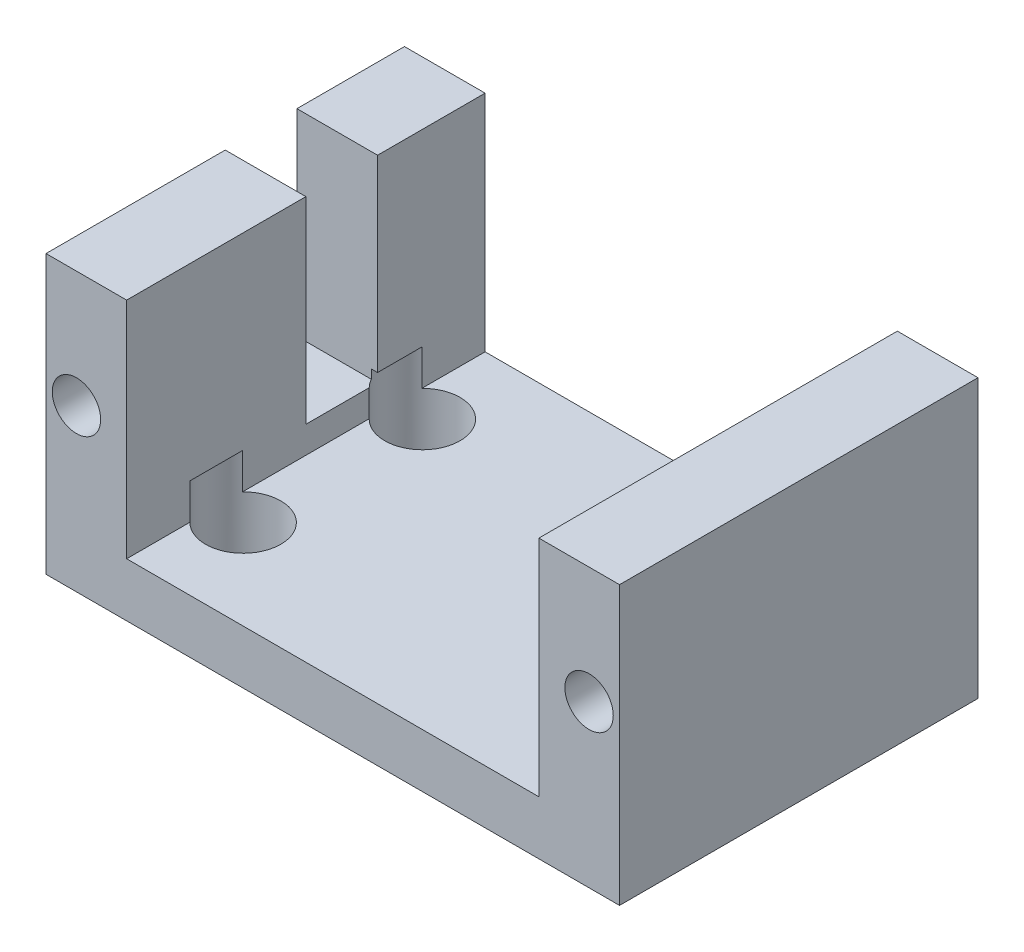
ISO-10303-21;
HEADER;
FILE_DESCRIPTION(('STEP AP214'),'2;1');
FILE_NAME('part.step','',(''),(''),'','','');
FILE_SCHEMA(('AUTOMOTIVE_DESIGN { 1 0 10303 214 1 1 1 1 }'));
ENDSEC;
DATA;
#1=APPLICATION_CONTEXT('core data for automotive mechanical design processes');
#2=APPLICATION_PROTOCOL_DEFINITION('international standard','automotive_design',2000,#1);
#3=PRODUCT_CONTEXT('',#1,'mechanical');
#4=PRODUCT('Part','Part','',(#3));
#5=PRODUCT_RELATED_PRODUCT_CATEGORY('part','',(#4));
#6=PRODUCT_DEFINITION_FORMATION('','',#4);
#7=PRODUCT_DEFINITION_CONTEXT('part definition',#1,'design');
#8=PRODUCT_DEFINITION('design','',#6,#7);
#9=PRODUCT_DEFINITION_SHAPE('','',#8);
#10=(LENGTH_UNIT() NAMED_UNIT(*) SI_UNIT(.MILLI.,.METRE.));
#11=(NAMED_UNIT(*) PLANE_ANGLE_UNIT() SI_UNIT($,.RADIAN.));
#12=(NAMED_UNIT(*) SI_UNIT($,.STERADIAN.) SOLID_ANGLE_UNIT());
#13=UNCERTAINTY_MEASURE_WITH_UNIT(LENGTH_MEASURE(1.E-05),#10,'distance_accuracy_value','');
#14=(GEOMETRIC_REPRESENTATION_CONTEXT(3) GLOBAL_UNCERTAINTY_ASSIGNED_CONTEXT((#13)) GLOBAL_UNIT_ASSIGNED_CONTEXT((#10,
#11,#12)) REPRESENTATION_CONTEXT('',''));
#15=CARTESIAN_POINT('',(0.,0.,0.));
#16=DIRECTION('',(0.,0.,1.));
#17=DIRECTION('',(1.,0.,0.));
#18=AXIS2_PLACEMENT_3D('',#15,#16,#17);
#19=CARTESIAN_POINT('',(-11.5,7.75,20.));
#20=DIRECTION('',(-1.,0.,0.));
#21=DIRECTION('',(0.,-1.,0.));
#22=AXIS2_PLACEMENT_3D('',#19,#20,#21);
#23=PLANE('',#22);
#24=DIRECTION('',(0.,0.,1.));
#25=VECTOR('',#24,1.);
#26=CARTESIAN_POINT('',(-11.5,-2.75,20.));
#27=LINE('',#26,#25);
#28=CARTESIAN_POINT('',(-11.5,-2.75,13.5303061543301));
#29=VERTEX_POINT('',#28);
#30=CARTESIAN_POINT('',(-11.5,-2.75,16.4696938456699));
#31=VERTEX_POINT('',#30);
#32=EDGE_CURVE('E213',#29,#31,#27,.T.);
#33=ORIENTED_EDGE('',*,*,#32,.F.);
#34=DIRECTION('',(0.,-1.,0.));
#35=VECTOR('',#34,1.);
#36=CARTESIAN_POINT('',(-11.5,-2.75,13.5303061543301));
#37=LINE('',#36,#35);
#38=CARTESIAN_POINT('',(-11.5,-4.75,13.5303061543301));
#39=VERTEX_POINT('',#38);
#40=EDGE_CURVE('E240',#29,#39,#37,.T.);
#41=ORIENTED_EDGE('',*,*,#40,.T.);
#42=DIRECTION('',(0.,0.,-1.));
#43=VECTOR('',#42,1.);
#44=CARTESIAN_POINT('',(-11.5,-4.75,20.));
#45=LINE('',#44,#43);
#46=CARTESIAN_POINT('',(-11.5,-4.75,6.46969384566991));
#47=VERTEX_POINT('',#46);
#48=EDGE_CURVE('E310',#39,#47,#45,.T.);
#49=ORIENTED_EDGE('',*,*,#48,.T.);
#50=DIRECTION('',(0.,-1.,0.));
#51=VECTOR('',#50,1.);
#52=CARTESIAN_POINT('',(-11.5,-2.75,6.46969384566991));
#53=LINE('',#52,#51);
#54=CARTESIAN_POINT('',(-11.5,-3.25,6.46969384566991));
#55=VERTEX_POINT('',#54);
#56=EDGE_CURVE('E402',#47,#55,#53,.F.);
#57=ORIENTED_EDGE('',*,*,#56,.T.);
#58=DIRECTION('',(0.,0.,-1.));
#59=VECTOR('',#58,1.);
#60=CARTESIAN_POINT('',(-11.5,-3.25,6.));
#61=LINE('',#60,#59);
#62=CARTESIAN_POINT('',(-11.5,-3.25,10.));
#63=VERTEX_POINT('',#62);
#64=EDGE_CURVE('E250',#63,#55,#61,.T.);
#65=ORIENTED_EDGE('',*,*,#64,.F.);
#66=DIRECTION('',(0.,-1.,0.));
#67=VECTOR('',#66,1.);
#68=CARTESIAN_POINT('',(-11.5,7.74999999999999,10.));
#69=LINE('',#68,#67);
#70=CARTESIAN_POINT('',(-11.5,7.75,10.));
#71=VERTEX_POINT('',#70);
#72=EDGE_CURVE('E270',#71,#63,#69,.T.);
#73=ORIENTED_EDGE('',*,*,#72,.F.);
#74=DIRECTION('',(0.,0.,-1.));
#75=VECTOR('',#74,1.);
#76=CARTESIAN_POINT('',(-11.5,7.75,20.));
#77=LINE('',#76,#75);
#78=CARTESIAN_POINT('',(-11.5,7.75,20.));
#79=VERTEX_POINT('',#78);
#80=EDGE_CURVE('E303',#79,#71,#77,.T.);
#81=ORIENTED_EDGE('',*,*,#80,.F.);
#82=DIRECTION('',(0.,1.,0.));
#83=VECTOR('',#82,1.);
#84=CARTESIAN_POINT('',(-11.5,7.75,20.));
#85=LINE('',#84,#83);
#86=CARTESIAN_POINT('',(-11.5,-4.75,20.));
#87=VERTEX_POINT('',#86);
#88=EDGE_CURVE('E289',#87,#79,#85,.T.);
#89=ORIENTED_EDGE('',*,*,#88,.F.);
#90=CARTESIAN_POINT('',(-11.5,-4.75,16.4696938456699));
#91=VERTEX_POINT('',#90);
#92=EDGE_CURVE('E307',#87,#91,#45,.T.);
#93=ORIENTED_EDGE('',*,*,#92,.T.);
#94=DIRECTION('',(0.,-1.,0.));
#95=VECTOR('',#94,1.);
#96=CARTESIAN_POINT('',(-11.5,-2.75,16.4696938456699));
#97=LINE('',#96,#95);
#98=EDGE_CURVE('E232',#91,#31,#97,.F.);
#99=ORIENTED_EDGE('',*,*,#98,.T.);
#100=EDGE_LOOP('',(#33,#41,#49,#57,#65,#73,#81,#89,#93,#99));
#101=FACE_BOUND('',#100,.T.);
#102=ADVANCED_FACE('F35',(#101),#23,.F.);
#103=CARTESIAN_POINT('',(-16.,7.75,20.));
#104=DIRECTION('',(0.,-1.,0.));
#105=DIRECTION('',(0.,0.,-1.));
#106=AXIS2_PLACEMENT_3D('',#103,#104,#105);
#107=PLANE('',#106);
#108=ORIENTED_EDGE('',*,*,#80,.T.);
#109=DIRECTION('',(-1.,0.,0.));
#110=VECTOR('',#109,1.);
#111=CARTESIAN_POINT('',(16.001,7.75,10.));
#112=LINE('',#111,#110);
#113=CARTESIAN_POINT('',(-16.,7.75,10.));
#114=VERTEX_POINT('',#113);
#115=EDGE_CURVE('E276',#71,#114,#112,.T.);
#116=ORIENTED_EDGE('',*,*,#115,.T.);
#117=DIRECTION('',(0.,0.,-1.));
#118=VECTOR('',#117,1.);
#119=CARTESIAN_POINT('',(-16.,7.75,20.));
#120=LINE('',#119,#118);
#121=CARTESIAN_POINT('',(-16.,7.75,20.));
#122=VERTEX_POINT('',#121);
#123=EDGE_CURVE('E343',#122,#114,#120,.T.);
#124=ORIENTED_EDGE('',*,*,#123,.F.);
#125=DIRECTION('',(-1.,0.,0.));
#126=VECTOR('',#125,1.);
#127=CARTESIAN_POINT('',(-16.,7.75,20.));
#128=LINE('',#127,#126);
#129=EDGE_CURVE('E318',#79,#122,#128,.T.);
#130=ORIENTED_EDGE('',*,*,#129,.F.);
#131=EDGE_LOOP('',(#108,#116,#124,#130));
#132=FACE_BOUND('',#131,.T.);
#133=ADVANCED_FACE('F391',(#132),#107,.F.);
#134=DIRECTION('',(-1.,0.,0.));
#135=VECTOR('',#134,1.);
#136=CARTESIAN_POINT('',(-16.,7.75,0.));
#137=LINE('',#136,#135);
#138=CARTESIAN_POINT('',(16.,7.75,0.));
#139=VERTEX_POINT('',#138);
#140=CARTESIAN_POINT('',(11.5,7.75,0.));
#141=VERTEX_POINT('',#140);
#142=EDGE_CURVE('E331',#139,#141,#137,.T.);
#143=ORIENTED_EDGE('',*,*,#142,.T.);
#144=DIRECTION('',(0.,0.,-1.));
#145=VECTOR('',#144,1.);
#146=CARTESIAN_POINT('',(11.5,7.75,20.));
#147=LINE('',#146,#145);
#148=CARTESIAN_POINT('',(11.5,7.75,20.));
#149=VERTEX_POINT('',#148);
#150=EDGE_CURVE('E300',#149,#141,#147,.T.);
#151=ORIENTED_EDGE('',*,*,#150,.F.);
#152=CARTESIAN_POINT('',(16.,7.75,20.));
#153=VERTEX_POINT('',#152);
#154=EDGE_CURVE('E320',#153,#149,#128,.T.);
#155=ORIENTED_EDGE('',*,*,#154,.F.);
#156=DIRECTION('',(0.,0.,-1.));
#157=VECTOR('',#156,1.);
#158=CARTESIAN_POINT('',(16.,7.75,20.));
#159=LINE('',#158,#157);
#160=EDGE_CURVE('E189',#153,#139,#159,.T.);
#161=ORIENTED_EDGE('',*,*,#160,.T.);
#162=EDGE_LOOP('',(#143,#151,#155,#161));
#163=FACE_BOUND('',#162,.T.);
#164=ADVANCED_FACE('F348',(#163),#107,.F.);
#165=CARTESIAN_POINT('',(16.,-7.75,20.));
#166=DIRECTION('',(-1.,0.,0.));
#167=DIRECTION('',(0.,0.,1.));
#168=AXIS2_PLACEMENT_3D('',#165,#166,#167);
#169=PLANE('',#168);
#170=DIRECTION('',(0.,1.,0.));
#171=VECTOR('',#170,1.);
#172=CARTESIAN_POINT('',(16.,-7.75,0.));
#173=LINE('',#172,#171);
#174=CARTESIAN_POINT('',(16.,-7.75,0.));
#175=VERTEX_POINT('',#174);
#176=EDGE_CURVE('E302',#175,#139,#173,.T.);
#177=ORIENTED_EDGE('',*,*,#176,.T.);
#178=ORIENTED_EDGE('',*,*,#160,.F.);
#179=DIRECTION('',(0.,1.,0.));
#180=VECTOR('',#179,1.);
#181=CARTESIAN_POINT('',(16.,-7.75,20.));
#182=LINE('',#181,#180);
#183=CARTESIAN_POINT('',(16.,-7.75,20.));
#184=VERTEX_POINT('',#183);
#185=EDGE_CURVE('E315',#184,#153,#182,.T.);
#186=ORIENTED_EDGE('',*,*,#185,.F.);
#187=DIRECTION('',(0.,0.,-1.));
#188=VECTOR('',#187,1.);
#189=CARTESIAN_POINT('',(16.,-7.75,20.));
#190=LINE('',#189,#188);
#191=EDGE_CURVE('E327',#184,#175,#190,.T.);
#192=ORIENTED_EDGE('',*,*,#191,.T.);
#193=EDGE_LOOP('',(#177,#178,#186,#192));
#194=FACE_BOUND('',#193,.T.);
#195=ADVANCED_FACE('F37',(#194),#169,.F.);
#196=CARTESIAN_POINT('',(-16.,7.75,6.));
#197=VERTEX_POINT('',#196);
#198=CARTESIAN_POINT('',(-16.,7.75,0.));
#199=VERTEX_POINT('',#198);
#200=EDGE_CURVE('E342',#197,#199,#120,.T.);
#201=ORIENTED_EDGE('',*,*,#200,.F.);
#202=DIRECTION('',(-1.,0.,0.));
#203=VECTOR('',#202,1.);
#204=CARTESIAN_POINT('',(16.001,7.75,6.));
#205=LINE('',#204,#203);
#206=CARTESIAN_POINT('',(-11.5,7.75,6.));
#207=VERTEX_POINT('',#206);
#208=EDGE_CURVE('E274',#207,#197,#205,.T.);
#209=ORIENTED_EDGE('',*,*,#208,.F.);
#210=CARTESIAN_POINT('',(-11.5,7.75,0.));
#211=VERTEX_POINT('',#210);
#212=EDGE_CURVE('E306',#207,#211,#77,.T.);
#213=ORIENTED_EDGE('',*,*,#212,.T.);
#214=EDGE_CURVE('E330',#211,#199,#137,.T.);
#215=ORIENTED_EDGE('',*,*,#214,.T.);
#216=EDGE_LOOP('',(#201,#209,#213,#215));
#217=FACE_BOUND('',#216,.T.);
#218=ADVANCED_FACE('F376',(#217),#107,.F.);
#219=CARTESIAN_POINT('',(-16.,-7.75,20.));
#220=DIRECTION('',(1.,0.,0.));
#221=DIRECTION('',(0.,0.,-1.));
#222=AXIS2_PLACEMENT_3D('',#219,#220,#221);
#223=PLANE('',#222);
#224=ORIENTED_EDGE('',*,*,#123,.T.);
#225=DIRECTION('',(0.,1.,0.));
#226=VECTOR('',#225,1.);
#227=CARTESIAN_POINT('',(-16.,7.75,10.));
#228=LINE('',#227,#226);
#229=CARTESIAN_POINT('',(-16.,-3.25,10.));
#230=VERTEX_POINT('',#229);
#231=EDGE_CURVE('E262',#230,#114,#228,.T.);
#232=ORIENTED_EDGE('',*,*,#231,.F.);
#233=DIRECTION('',(0.,0.,1.));
#234=VECTOR('',#233,1.);
#235=CARTESIAN_POINT('',(-16.,-3.25,6.));
#236=LINE('',#235,#234);
#237=CARTESIAN_POINT('',(-16.,-3.25,6.));
#238=VERTEX_POINT('',#237);
#239=EDGE_CURVE('E265',#238,#230,#236,.T.);
#240=ORIENTED_EDGE('',*,*,#239,.F.);
#241=DIRECTION('',(0.,-1.,0.));
#242=VECTOR('',#241,1.);
#243=CARTESIAN_POINT('',(-16.,7.75,6.));
#244=LINE('',#243,#242);
#245=EDGE_CURVE('E268',#197,#238,#244,.T.);
#246=ORIENTED_EDGE('',*,*,#245,.F.);
#247=ORIENTED_EDGE('',*,*,#200,.T.);
#248=DIRECTION('',(0.,-1.,0.));
#249=VECTOR('',#248,1.);
#250=CARTESIAN_POINT('',(-16.,-7.75,0.));
#251=LINE('',#250,#249);
#252=CARTESIAN_POINT('',(-16.,-7.75,0.));
#253=VERTEX_POINT('',#252);
#254=EDGE_CURVE('E334',#199,#253,#251,.T.);
#255=ORIENTED_EDGE('',*,*,#254,.T.);
#256=DIRECTION('',(0.,0.,-1.));
#257=VECTOR('',#256,1.);
#258=CARTESIAN_POINT('',(-16.,-7.75,20.));
#259=LINE('',#258,#257);
#260=CARTESIAN_POINT('',(-16.,-7.75,20.));
#261=VERTEX_POINT('',#260);
#262=EDGE_CURVE('E339',#261,#253,#259,.T.);
#263=ORIENTED_EDGE('',*,*,#262,.F.);
#264=DIRECTION('',(0.,-1.,0.));
#265=VECTOR('',#264,1.);
#266=CARTESIAN_POINT('',(-16.,-7.75,20.));
#267=LINE('',#266,#265);
#268=EDGE_CURVE('E323',#122,#261,#267,.T.);
#269=ORIENTED_EDGE('',*,*,#268,.F.);
#270=EDGE_LOOP('',(#224,#232,#240,#246,#247,#255,#263,#269));
#271=FACE_BOUND('',#270,.T.);
#272=ADVANCED_FACE('F370',(#271),#223,.F.);
#273=CARTESIAN_POINT('',(-16.,-7.75,20.));
#274=DIRECTION('',(0.,1.,0.));
#275=DIRECTION('',(0.,0.,1.));
#276=AXIS2_PLACEMENT_3D('',#273,#274,#275);
#277=PLANE('',#276);
#278=CARTESIAN_POINT('',(10.,-7.75,5.));
#279=DIRECTION('',(0.,-1.,0.));
#280=DIRECTION('',(0.,0.,-1.));
#281=AXIS2_PLACEMENT_3D('',#278,#279,#280);
#282=CIRCLE('',#281,2.1);
#283=CARTESIAN_POINT('',(10.,-7.75,2.9));
#284=VERTEX_POINT('',#283);
#285=EDGE_CURVE('E417',#284,#284,#282,.T.);
#286=ORIENTED_EDGE('',*,*,#285,.F.);
#287=EDGE_LOOP('',(#286));
#288=FACE_BOUND('',#287,.T.);
#289=CARTESIAN_POINT('',(-10.,-7.75,15.));
#290=DIRECTION('',(0.,-1.,0.));
#291=DIRECTION('',(0.,0.,-1.));
#292=AXIS2_PLACEMENT_3D('',#289,#290,#291);
#293=CIRCLE('',#292,2.1);
#294=CARTESIAN_POINT('',(-10.,-7.75,12.9));
#295=VERTEX_POINT('',#294);
#296=EDGE_CURVE('E196',#295,#295,#293,.T.);
#297=ORIENTED_EDGE('',*,*,#296,.F.);
#298=EDGE_LOOP('',(#297));
#299=FACE_BOUND('',#298,.T.);
#300=CARTESIAN_POINT('',(-10.,-7.75,5.));
#301=DIRECTION('',(0.,-1.,0.));
#302=DIRECTION('',(0.,0.,-1.));
#303=AXIS2_PLACEMENT_3D('',#300,#301,#302);
#304=CIRCLE('',#303,2.1);
#305=CARTESIAN_POINT('',(-10.,-7.75,2.9));
#306=VERTEX_POINT('',#305);
#307=EDGE_CURVE('E197',#306,#306,#304,.T.);
#308=ORIENTED_EDGE('',*,*,#307,.F.);
#309=EDGE_LOOP('',(#308));
#310=FACE_BOUND('',#309,.T.);
#311=CARTESIAN_POINT('',(10.,-7.75,15.));
#312=DIRECTION('',(0.,-1.,0.));
#313=DIRECTION('',(0.,0.,-1.));
#314=AXIS2_PLACEMENT_3D('',#311,#312,#313);
#315=CIRCLE('',#314,2.1);
#316=CARTESIAN_POINT('',(10.,-7.75,12.9));
#317=VERTEX_POINT('',#316);
#318=EDGE_CURVE('E223',#317,#317,#315,.T.);
#319=ORIENTED_EDGE('',*,*,#318,.F.);
#320=EDGE_LOOP('',(#319));
#321=FACE_BOUND('',#320,.T.);
#322=DIRECTION('',(1.,0.,0.));
#323=VECTOR('',#322,1.);
#324=CARTESIAN_POINT('',(-16.,-7.75,0.));
#325=LINE('',#324,#323);
#326=EDGE_CURVE('E319',#253,#175,#325,.T.);
#327=ORIENTED_EDGE('',*,*,#326,.T.);
#328=ORIENTED_EDGE('',*,*,#191,.F.);
#329=DIRECTION('',(1.,0.,0.));
#330=VECTOR('',#329,1.);
#331=CARTESIAN_POINT('',(-16.,-7.75,20.));
#332=LINE('',#331,#330);
#333=EDGE_CURVE('E325',#261,#184,#332,.T.);
#334=ORIENTED_EDGE('',*,*,#333,.F.);
#335=ORIENTED_EDGE('',*,*,#262,.T.);
#336=EDGE_LOOP('',(#327,#328,#334,#335));
#337=FACE_BOUND('',#336,.T.);
#338=ADVANCED_FACE('F368',(#288,#299,#310,#321,#337),#277,.F.);
#339=CARTESIAN_POINT('',(0.,0.,20.));
#340=DIRECTION('',(0.,0.,-1.));
#341=DIRECTION('',(-1.,0.,0.));
#342=AXIS2_PLACEMENT_3D('',#339,#340,#341);
#343=PLANE('',#342);
#344=CARTESIAN_POINT('',(-14.3,1.25,20.));
#345=DIRECTION('',(0.,0.,1.));
#346=DIRECTION('',(1.,0.,0.));
#347=AXIS2_PLACEMENT_3D('',#344,#345,#346);
#348=CIRCLE('',#347,1.35000000000001);
#349=CARTESIAN_POINT('',(-12.95,1.25,20.));
#350=VERTEX_POINT('',#349);
#351=EDGE_CURVE('E251',#350,#350,#348,.T.);
#352=ORIENTED_EDGE('',*,*,#351,.F.);
#353=EDGE_LOOP('',(#352));
#354=FACE_BOUND('',#353,.T.);
#355=CARTESIAN_POINT('',(14.3,1.25,20.));
#356=DIRECTION('',(0.,0.,1.));
#357=DIRECTION('',(1.,0.,0.));
#358=AXIS2_PLACEMENT_3D('',#355,#356,#357);
#359=CIRCLE('',#358,1.35);
#360=CARTESIAN_POINT('',(15.65,1.25,20.));
#361=VERTEX_POINT('',#360);
#362=EDGE_CURVE('E246',#361,#361,#359,.T.);
#363=ORIENTED_EDGE('',*,*,#362,.F.);
#364=EDGE_LOOP('',(#363));
#365=FACE_BOUND('',#364,.T.);
#366=ORIENTED_EDGE('',*,*,#154,.T.);
#367=DIRECTION('',(0.,-1.,0.));
#368=VECTOR('',#367,1.);
#369=CARTESIAN_POINT('',(11.5,7.75,20.));
#370=LINE('',#369,#368);
#371=CARTESIAN_POINT('',(11.5,-4.75,20.));
#372=VERTEX_POINT('',#371);
#373=EDGE_CURVE('E282',#149,#372,#370,.T.);
#374=ORIENTED_EDGE('',*,*,#373,.T.);
#375=DIRECTION('',(-1.,0.,0.));
#376=VECTOR('',#375,1.);
#377=CARTESIAN_POINT('',(11.5,-4.75,20.));
#378=LINE('',#377,#376);
#379=EDGE_CURVE('E285',#372,#87,#378,.T.);
#380=ORIENTED_EDGE('',*,*,#379,.T.);
#381=ORIENTED_EDGE('',*,*,#88,.T.);
#382=ORIENTED_EDGE('',*,*,#129,.T.);
#383=ORIENTED_EDGE('',*,*,#268,.T.);
#384=ORIENTED_EDGE('',*,*,#333,.T.);
#385=ORIENTED_EDGE('',*,*,#185,.T.);
#386=EDGE_LOOP('',(#366,#374,#380,#381,#382,#383,#384,#385));
#387=FACE_BOUND('',#386,.T.);
#388=ADVANCED_FACE('F363',(#354,#365,#387),#343,.F.);
#389=CARTESIAN_POINT('',(0.,0.,0.));
#390=DIRECTION('',(0.,0.,-1.));
#391=DIRECTION('',(-1.,0.,0.));
#392=AXIS2_PLACEMENT_3D('',#389,#390,#391);
#393=PLANE('',#392);
#394=DIRECTION('',(0.,-1.,0.));
#395=VECTOR('',#394,1.);
#396=CARTESIAN_POINT('',(11.5,7.75,0.));
#397=LINE('',#396,#395);
#398=CARTESIAN_POINT('',(11.5,-4.75,0.));
#399=VERTEX_POINT('',#398);
#400=EDGE_CURVE('E281',#141,#399,#397,.T.);
#401=ORIENTED_EDGE('',*,*,#400,.F.);
#402=ORIENTED_EDGE('',*,*,#142,.F.);
#403=ORIENTED_EDGE('',*,*,#176,.F.);
#404=ORIENTED_EDGE('',*,*,#326,.F.);
#405=ORIENTED_EDGE('',*,*,#254,.F.);
#406=ORIENTED_EDGE('',*,*,#214,.F.);
#407=DIRECTION('',(0.,1.,0.));
#408=VECTOR('',#407,1.);
#409=CARTESIAN_POINT('',(-11.5,7.75,0.));
#410=LINE('',#409,#408);
#411=CARTESIAN_POINT('',(-11.5,-4.75,0.));
#412=VERTEX_POINT('',#411);
#413=EDGE_CURVE('E286',#412,#211,#410,.T.);
#414=ORIENTED_EDGE('',*,*,#413,.F.);
#415=DIRECTION('',(-1.,0.,0.));
#416=VECTOR('',#415,1.);
#417=CARTESIAN_POINT('',(11.5,-4.75,0.));
#418=LINE('',#417,#416);
#419=EDGE_CURVE('E295',#399,#412,#418,.T.);
#420=ORIENTED_EDGE('',*,*,#419,.F.);
#421=EDGE_LOOP('',(#401,#402,#403,#404,#405,#406,#414,#420));
#422=FACE_BOUND('',#421,.T.);
#423=ADVANCED_FACE('F357',(#422),#393,.T.);
#424=CARTESIAN_POINT('',(11.5,7.75,20.));
#425=DIRECTION('',(1.,0.,0.));
#426=DIRECTION('',(0.,1.,0.));
#427=AXIS2_PLACEMENT_3D('',#424,#425,#426);
#428=PLANE('',#427);
#429=DIRECTION('',(0.,0.,-1.));
#430=VECTOR('',#429,1.);
#431=CARTESIAN_POINT('',(11.5,-2.75,20.));
#432=LINE('',#431,#430);
#433=CARTESIAN_POINT('',(11.5,-2.75,6.46969384566991));
#434=VERTEX_POINT('',#433);
#435=CARTESIAN_POINT('',(11.5,-2.75,3.5303061543301));
#436=VERTEX_POINT('',#435);
#437=EDGE_CURVE('E11',#434,#436,#432,.T.);
#438=ORIENTED_EDGE('',*,*,#437,.F.);
#439=DIRECTION('',(0.,-1.,0.));
#440=VECTOR('',#439,1.);
#441=CARTESIAN_POINT('',(11.5,-2.75,6.46969384566991));
#442=LINE('',#441,#440);
#443=CARTESIAN_POINT('',(11.5,-4.75,6.46969384566991));
#444=VERTEX_POINT('',#443);
#445=EDGE_CURVE('E244',#434,#444,#442,.T.);
#446=ORIENTED_EDGE('',*,*,#445,.T.);
#447=DIRECTION('',(0.,0.,-1.));
#448=VECTOR('',#447,1.);
#449=CARTESIAN_POINT('',(11.5,-4.75,20.));
#450=LINE('',#449,#448);
#451=CARTESIAN_POINT('',(11.5,-4.75,13.5303061543301));
#452=VERTEX_POINT('',#451);
#453=EDGE_CURVE('E230',#452,#444,#450,.T.);
#454=ORIENTED_EDGE('',*,*,#453,.F.);
#455=DIRECTION('',(0.,-1.,0.));
#456=VECTOR('',#455,1.);
#457=CARTESIAN_POINT('',(11.5,-2.75,13.5303061543301));
#458=LINE('',#457,#456);
#459=CARTESIAN_POINT('',(11.5,-2.75,13.5303061543301));
#460=VERTEX_POINT('',#459);
#461=EDGE_CURVE('E58',#452,#460,#458,.F.);
#462=ORIENTED_EDGE('',*,*,#461,.T.);
#463=DIRECTION('',(0.,0.,-1.));
#464=VECTOR('',#463,1.);
#465=CARTESIAN_POINT('',(11.5,-2.75,20.));
#466=LINE('',#465,#464);
#467=CARTESIAN_POINT('',(11.5,-2.75,16.4696938456699));
#468=VERTEX_POINT('',#467);
#469=EDGE_CURVE('E43',#468,#460,#466,.T.);
#470=ORIENTED_EDGE('',*,*,#469,.F.);
#471=DIRECTION('',(0.,-1.,0.));
#472=VECTOR('',#471,1.);
#473=CARTESIAN_POINT('',(11.5,-2.75,16.4696938456699));
#474=LINE('',#473,#472);
#475=CARTESIAN_POINT('',(11.5,-4.75,16.4696938456699));
#476=VERTEX_POINT('',#475);
#477=EDGE_CURVE('E222',#468,#476,#474,.T.);
#478=ORIENTED_EDGE('',*,*,#477,.T.);
#479=EDGE_CURVE('E312',#372,#476,#450,.T.);
#480=ORIENTED_EDGE('',*,*,#479,.F.);
#481=ORIENTED_EDGE('',*,*,#373,.F.);
#482=ORIENTED_EDGE('',*,*,#150,.T.);
#483=ORIENTED_EDGE('',*,*,#400,.T.);
#484=CARTESIAN_POINT('',(11.5,-4.75,3.5303061543301));
#485=VERTEX_POINT('',#484);
#486=EDGE_CURVE('E292',#485,#399,#450,.T.);
#487=ORIENTED_EDGE('',*,*,#486,.F.);
#488=DIRECTION('',(0.,-1.,0.));
#489=VECTOR('',#488,1.);
#490=CARTESIAN_POINT('',(11.5,-2.75,3.5303061543301));
#491=LINE('',#490,#489);
#492=EDGE_CURVE('E50',#485,#436,#491,.F.);
#493=ORIENTED_EDGE('',*,*,#492,.T.);
#494=EDGE_LOOP('',(#438,#446,#454,#462,#470,#478,#480,#481,#482,#483,#487,#493));
#495=FACE_BOUND('',#494,.T.);
#496=ADVANCED_FACE('F227',(#495),#428,.F.);
#497=DIRECTION('',(0.,0.,1.));
#498=VECTOR('',#497,1.);
#499=CARTESIAN_POINT('',(-11.5,-2.75,20.));
#500=LINE('',#499,#498);
#501=CARTESIAN_POINT('',(-11.5,-2.75,3.53030615433009));
#502=VERTEX_POINT('',#501);
#503=CARTESIAN_POINT('',(-11.5,-2.75,6.));
#504=VERTEX_POINT('',#503);
#505=EDGE_CURVE('E184',#502,#504,#500,.T.);
#506=ORIENTED_EDGE('',*,*,#505,.F.);
#507=DIRECTION('',(0.,-1.,0.));
#508=VECTOR('',#507,1.);
#509=CARTESIAN_POINT('',(-11.5,-2.75,3.53030615433009));
#510=LINE('',#509,#508);
#511=CARTESIAN_POINT('',(-11.5,-4.75,3.53030615433009));
#512=VERTEX_POINT('',#511);
#513=EDGE_CURVE('E195',#502,#512,#510,.T.);
#514=ORIENTED_EDGE('',*,*,#513,.T.);
#515=EDGE_CURVE('E311',#512,#412,#45,.T.);
#516=ORIENTED_EDGE('',*,*,#515,.T.);
#517=ORIENTED_EDGE('',*,*,#413,.T.);
#518=ORIENTED_EDGE('',*,*,#212,.F.);
#519=DIRECTION('',(0.,1.,0.));
#520=VECTOR('',#519,1.);
#521=CARTESIAN_POINT('',(-11.5,7.74999999999999,6.));
#522=LINE('',#521,#520);
#523=EDGE_CURVE('E261',#504,#207,#522,.T.);
#524=ORIENTED_EDGE('',*,*,#523,.F.);
#525=EDGE_LOOP('',(#506,#514,#516,#517,#518,#524));
#526=FACE_BOUND('',#525,.T.);
#527=ADVANCED_FACE('F380',(#526),#23,.F.);
#528=CARTESIAN_POINT('',(11.5,-4.75,20.));
#529=DIRECTION('',(0.,-1.,0.));
#530=DIRECTION('',(0.,0.,-1.));
#531=AXIS2_PLACEMENT_3D('',#528,#529,#530);
#532=PLANE('',#531);
#533=ORIENTED_EDGE('',*,*,#453,.T.);
#534=CARTESIAN_POINT('',(10.,-4.75,5.));
#535=DIRECTION('',(0.,-1.,0.));
#536=DIRECTION('',(0.,0.,-1.));
#537=AXIS2_PLACEMENT_3D('',#534,#535,#536);
#538=CIRCLE('',#537,2.1);
#539=EDGE_CURVE('E211',#444,#485,#538,.T.);
#540=ORIENTED_EDGE('',*,*,#539,.T.);
#541=ORIENTED_EDGE('',*,*,#486,.T.);
#542=ORIENTED_EDGE('',*,*,#419,.T.);
#543=ORIENTED_EDGE('',*,*,#515,.F.);
#544=CARTESIAN_POINT('',(-10.,-4.75,5.));
#545=DIRECTION('',(0.,-1.,0.));
#546=DIRECTION('',(0.,0.,-1.));
#547=AXIS2_PLACEMENT_3D('',#544,#545,#546);
#548=CIRCLE('',#547,2.1);
#549=EDGE_CURVE('E234',#512,#47,#548,.T.);
#550=ORIENTED_EDGE('',*,*,#549,.T.);
#551=ORIENTED_EDGE('',*,*,#48,.F.);
#552=CARTESIAN_POINT('',(-10.,-4.75,15.));
#553=DIRECTION('',(0.,-1.,0.));
#554=DIRECTION('',(0.,0.,-1.));
#555=AXIS2_PLACEMENT_3D('',#552,#553,#554);
#556=CIRCLE('',#555,2.1);
#557=EDGE_CURVE('E205',#39,#91,#556,.T.);
#558=ORIENTED_EDGE('',*,*,#557,.T.);
#559=ORIENTED_EDGE('',*,*,#92,.F.);
#560=ORIENTED_EDGE('',*,*,#379,.F.);
#561=ORIENTED_EDGE('',*,*,#479,.T.);
#562=CARTESIAN_POINT('',(10.,-4.75,15.));
#563=DIRECTION('',(0.,-1.,0.));
#564=DIRECTION('',(0.,0.,-1.));
#565=AXIS2_PLACEMENT_3D('',#562,#563,#564);
#566=CIRCLE('',#565,2.1);
#567=EDGE_CURVE('E203',#476,#452,#566,.T.);
#568=ORIENTED_EDGE('',*,*,#567,.T.);
#569=EDGE_LOOP('',(#533,#540,#541,#542,#543,#550,#551,#558,#559,#560,#561,#568));
#570=FACE_BOUND('',#569,.T.);
#571=ADVANCED_FACE('F384',(#570),#532,.F.);
#572=CARTESIAN_POINT('',(16.001,-3.25,6.));
#573=DIRECTION('',(0.,-1.,0.));
#574=DIRECTION('',(0.,0.,-1.));
#575=AXIS2_PLACEMENT_3D('',#572,#573,#574);
#576=PLANE('',#575);
#577=ORIENTED_EDGE('',*,*,#64,.T.);
#578=CARTESIAN_POINT('',(-10.,-3.25,5.));
#579=DIRECTION('',(0.,-1.,0.));
#580=DIRECTION('',(0.,0.,-1.));
#581=AXIS2_PLACEMENT_3D('',#578,#579,#580);
#582=CIRCLE('',#581,2.1);
#583=CARTESIAN_POINT('',(-11.8466185312619,-3.25,6.));
#584=VERTEX_POINT('',#583);
#585=EDGE_CURVE('E400',#55,#584,#582,.T.);
#586=ORIENTED_EDGE('',*,*,#585,.T.);
#587=DIRECTION('',(-1.,0.,0.));
#588=VECTOR('',#587,1.);
#589=CARTESIAN_POINT('',(16.001,-3.25,6.));
#590=LINE('',#589,#588);
#591=EDGE_CURVE('E202',#584,#238,#590,.T.);
#592=ORIENTED_EDGE('',*,*,#591,.T.);
#593=ORIENTED_EDGE('',*,*,#239,.T.);
#594=DIRECTION('',(-1.,0.,0.));
#595=VECTOR('',#594,1.);
#596=CARTESIAN_POINT('',(16.001,-3.25,10.));
#597=LINE('',#596,#595);
#598=EDGE_CURVE('E264',#63,#230,#597,.T.);
#599=ORIENTED_EDGE('',*,*,#598,.F.);
#600=EDGE_LOOP('',(#577,#586,#592,#593,#599));
#601=FACE_BOUND('',#600,.T.);
#602=ADVANCED_FACE('F399',(#601),#576,.F.);
#603=CARTESIAN_POINT('',(16.001,7.75,10.));
#604=DIRECTION('',(0.,0.,1.));
#605=DIRECTION('',(0.,-1.,0.));
#606=AXIS2_PLACEMENT_3D('',#603,#604,#605);
#607=PLANE('',#606);
#608=CARTESIAN_POINT('',(-14.3,1.25,10.));
#609=DIRECTION('',(0.,0.,1.));
#610=DIRECTION('',(1.,0.,0.));
#611=AXIS2_PLACEMENT_3D('',#608,#609,#610);
#612=CIRCLE('',#611,1.35000000000001);
#613=CARTESIAN_POINT('',(-12.95,1.25,10.));
#614=VERTEX_POINT('',#613);
#615=EDGE_CURVE('E247',#614,#614,#612,.T.);
#616=ORIENTED_EDGE('',*,*,#615,.T.);
#617=EDGE_LOOP('',(#616));
#618=FACE_BOUND('',#617,.T.);
#619=ORIENTED_EDGE('',*,*,#72,.T.);
#620=ORIENTED_EDGE('',*,*,#598,.T.);
#621=ORIENTED_EDGE('',*,*,#231,.T.);
#622=ORIENTED_EDGE('',*,*,#115,.F.);
#623=EDGE_LOOP('',(#619,#620,#621,#622));
#624=FACE_BOUND('',#623,.T.);
#625=ADVANCED_FACE('F395',(#618,#624),#607,.F.);
#626=CARTESIAN_POINT('',(16.001,7.75,6.));
#627=DIRECTION('',(0.,0.,-1.));
#628=DIRECTION('',(0.,1.,0.));
#629=AXIS2_PLACEMENT_3D('',#626,#627,#628);
#630=PLANE('',#629);
#631=ORIENTED_EDGE('',*,*,#591,.F.);
#632=DIRECTION('',(0.,-1.,0.));
#633=VECTOR('',#632,1.);
#634=CARTESIAN_POINT('',(-11.8466185312619,-2.75,6.));
#635=LINE('',#634,#633);
#636=CARTESIAN_POINT('',(-11.8466185312619,-2.75,6.));
#637=VERTEX_POINT('',#636);
#638=EDGE_CURVE('E188',#584,#637,#635,.F.);
#639=ORIENTED_EDGE('',*,*,#638,.T.);
#640=DIRECTION('',(-1.,0.,0.));
#641=VECTOR('',#640,1.);
#642=CARTESIAN_POINT('',(16.001,-2.75,6.));
#643=LINE('',#642,#641);
#644=EDGE_CURVE('E179',#504,#637,#643,.T.);
#645=ORIENTED_EDGE('',*,*,#644,.F.);
#646=ORIENTED_EDGE('',*,*,#523,.T.);
#647=ORIENTED_EDGE('',*,*,#208,.T.);
#648=ORIENTED_EDGE('',*,*,#245,.T.);
#649=EDGE_LOOP('',(#631,#639,#645,#646,#647,#648));
#650=FACE_BOUND('',#649,.T.);
#651=ADVANCED_FACE('F200',(#650),#630,.F.);
#652=CARTESIAN_POINT('',(-14.3,1.25,10.));
#653=DIRECTION('',(0.,0.,1.));
#654=DIRECTION('',(1.,0.,0.));
#655=AXIS2_PLACEMENT_3D('',#652,#653,#654);
#656=CYLINDRICAL_SURFACE('',#655,1.35000000000001);
#657=ORIENTED_EDGE('',*,*,#615,.F.);
#658=EDGE_LOOP('',(#657));
#659=FACE_BOUND('',#658,.T.);
#660=ORIENTED_EDGE('',*,*,#351,.T.);
#661=EDGE_LOOP('',(#660));
#662=FACE_BOUND('',#661,.T.);
#663=ADVANCED_FACE('F550',(#659,#662),#656,.F.);
#664=CARTESIAN_POINT('',(14.3,1.25,10.));
#665=DIRECTION('',(0.,0.,1.));
#666=DIRECTION('',(1.,0.,0.));
#667=AXIS2_PLACEMENT_3D('',#664,#665,#666);
#668=CYLINDRICAL_SURFACE('',#667,1.35);
#669=CARTESIAN_POINT('',(14.3,1.25,10.));
#670=DIRECTION('',(0.,0.,1.));
#671=DIRECTION('',(1.,0.,0.));
#672=AXIS2_PLACEMENT_3D('',#669,#670,#671);
#673=CIRCLE('',#672,1.35);
#674=CARTESIAN_POINT('',(15.65,1.25,10.));
#675=VERTEX_POINT('',#674);
#676=EDGE_CURVE('E254',#675,#675,#673,.T.);
#677=ORIENTED_EDGE('',*,*,#676,.F.);
#678=EDGE_LOOP('',(#677));
#679=FACE_BOUND('',#678,.T.);
#680=ORIENTED_EDGE('',*,*,#362,.T.);
#681=EDGE_LOOP('',(#680));
#682=FACE_BOUND('',#681,.T.);
#683=ADVANCED_FACE('F558',(#679,#682),#668,.F.);
#684=CARTESIAN_POINT('',(14.3,1.25,10.));
#685=DIRECTION('',(0.,0.,1.));
#686=DIRECTION('',(1.,0.,0.));
#687=AXIS2_PLACEMENT_3D('',#684,#685,#686);
#688=PLANE('',#687);
#689=ORIENTED_EDGE('',*,*,#676,.T.);
#690=EDGE_LOOP('',(#689));
#691=FACE_BOUND('',#690,.T.);
#692=ADVANCED_FACE('F566',(#691),#688,.T.);
#693=CARTESIAN_POINT('',(-10.,-2.75,5.));
#694=DIRECTION('',(0.,-1.,0.));
#695=DIRECTION('',(0.,0.,-1.));
#696=AXIS2_PLACEMENT_3D('',#693,#694,#695);
#697=CYLINDRICAL_SURFACE('',#696,2.1);
#698=ORIENTED_EDGE('',*,*,#307,.T.);
#699=EDGE_LOOP('',(#698));
#700=FACE_BOUND('',#699,.T.);
#701=CARTESIAN_POINT('',(-10.,-2.75,5.));
#702=DIRECTION('',(0.,-1.,0.));
#703=DIRECTION('',(0.,0.,-1.));
#704=AXIS2_PLACEMENT_3D('',#701,#702,#703);
#705=CIRCLE('',#704,2.1);
#706=EDGE_CURVE('E182',#637,#502,#705,.T.);
#707=ORIENTED_EDGE('',*,*,#706,.F.);
#708=ORIENTED_EDGE('',*,*,#638,.F.);
#709=ORIENTED_EDGE('',*,*,#585,.F.);
#710=ORIENTED_EDGE('',*,*,#56,.F.);
#711=ORIENTED_EDGE('',*,*,#549,.F.);
#712=ORIENTED_EDGE('',*,*,#513,.F.);
#713=EDGE_LOOP('',(#707,#708,#709,#710,#711,#712));
#714=FACE_BOUND('',#713,.T.);
#715=ADVANCED_FACE('F192',(#700,#714),#697,.F.);
#716=CARTESIAN_POINT('',(-10.,-2.75,5.));
#717=DIRECTION('',(0.,-1.,0.));
#718=DIRECTION('',(0.,0.,-1.));
#719=AXIS2_PLACEMENT_3D('',#716,#717,#718);
#720=PLANE('',#719);
#721=ORIENTED_EDGE('',*,*,#505,.T.);
#722=ORIENTED_EDGE('',*,*,#644,.T.);
#723=ORIENTED_EDGE('',*,*,#706,.T.);
#724=EDGE_LOOP('',(#721,#722,#723));
#725=FACE_BOUND('',#724,.T.);
#726=ADVANCED_FACE('F181',(#725),#720,.T.);
#727=CARTESIAN_POINT('',(10.,-2.75,15.));
#728=DIRECTION('',(0.,-1.,0.));
#729=DIRECTION('',(0.,0.,-1.));
#730=AXIS2_PLACEMENT_3D('',#727,#728,#729);
#731=PLANE('',#730);
#732=ORIENTED_EDGE('',*,*,#469,.T.);
#733=CARTESIAN_POINT('',(10.,-2.75,15.));
#734=DIRECTION('',(0.,-1.,0.));
#735=DIRECTION('',(0.,0.,-1.));
#736=AXIS2_PLACEMENT_3D('',#733,#734,#735);
#737=CIRCLE('',#736,2.1);
#738=EDGE_CURVE('E218',#460,#468,#737,.T.);
#739=ORIENTED_EDGE('',*,*,#738,.T.);
#740=EDGE_LOOP('',(#732,#739));
#741=FACE_BOUND('',#740,.T.);
#742=ADVANCED_FACE('F217',(#741),#731,.T.);
#743=CARTESIAN_POINT('',(10.,-2.75,15.));
#744=DIRECTION('',(0.,-1.,0.));
#745=DIRECTION('',(0.,0.,-1.));
#746=AXIS2_PLACEMENT_3D('',#743,#744,#745);
#747=CYLINDRICAL_SURFACE('',#746,2.1);
#748=ORIENTED_EDGE('',*,*,#318,.T.);
#749=EDGE_LOOP('',(#748));
#750=FACE_BOUND('',#749,.T.);
#751=ORIENTED_EDGE('',*,*,#738,.F.);
#752=ORIENTED_EDGE('',*,*,#461,.F.);
#753=ORIENTED_EDGE('',*,*,#567,.F.);
#754=ORIENTED_EDGE('',*,*,#477,.F.);
#755=EDGE_LOOP('',(#751,#752,#753,#754));
#756=FACE_BOUND('',#755,.T.);
#757=ADVANCED_FACE('F221',(#750,#756),#747,.F.);
#758=CARTESIAN_POINT('',(-10.,-2.75,15.));
#759=DIRECTION('',(0.,-1.,0.));
#760=DIRECTION('',(0.,0.,-1.));
#761=AXIS2_PLACEMENT_3D('',#758,#759,#760);
#762=PLANE('',#761);
#763=ORIENTED_EDGE('',*,*,#32,.T.);
#764=CARTESIAN_POINT('',(-10.,-2.75,15.));
#765=DIRECTION('',(0.,-1.,0.));
#766=DIRECTION('',(0.,0.,-1.));
#767=AXIS2_PLACEMENT_3D('',#764,#765,#766);
#768=CIRCLE('',#767,2.1);
#769=EDGE_CURVE('E414',#31,#29,#768,.T.);
#770=ORIENTED_EDGE('',*,*,#769,.T.);
#771=EDGE_LOOP('',(#763,#770));
#772=FACE_BOUND('',#771,.T.);
#773=ADVANCED_FACE('F416',(#772),#762,.T.);
#774=CARTESIAN_POINT('',(-10.,-2.75,15.));
#775=DIRECTION('',(0.,-1.,0.));
#776=DIRECTION('',(0.,0.,-1.));
#777=AXIS2_PLACEMENT_3D('',#774,#775,#776);
#778=CYLINDRICAL_SURFACE('',#777,2.1);
#779=ORIENTED_EDGE('',*,*,#296,.T.);
#780=EDGE_LOOP('',(#779));
#781=FACE_BOUND('',#780,.T.);
#782=ORIENTED_EDGE('',*,*,#769,.F.);
#783=ORIENTED_EDGE('',*,*,#98,.F.);
#784=ORIENTED_EDGE('',*,*,#557,.F.);
#785=ORIENTED_EDGE('',*,*,#40,.F.);
#786=EDGE_LOOP('',(#782,#783,#784,#785));
#787=FACE_BOUND('',#786,.T.);
#788=ADVANCED_FACE('F413',(#781,#787),#778,.F.);
#789=CARTESIAN_POINT('',(10.,-2.75,5.));
#790=DIRECTION('',(0.,-1.,0.));
#791=DIRECTION('',(0.,0.,-1.));
#792=AXIS2_PLACEMENT_3D('',#789,#790,#791);
#793=PLANE('',#792);
#794=ORIENTED_EDGE('',*,*,#437,.T.);
#795=CARTESIAN_POINT('',(10.,-2.75,5.));
#796=DIRECTION('',(0.,-1.,0.));
#797=DIRECTION('',(0.,0.,-1.));
#798=AXIS2_PLACEMENT_3D('',#795,#796,#797);
#799=CIRCLE('',#798,2.1);
#800=EDGE_CURVE('E420',#436,#434,#799,.T.);
#801=ORIENTED_EDGE('',*,*,#800,.T.);
#802=EDGE_LOOP('',(#794,#801));
#803=FACE_BOUND('',#802,.T.);
#804=ADVANCED_FACE('F614',(#803),#793,.T.);
#805=CARTESIAN_POINT('',(10.,-2.75,5.));
#806=DIRECTION('',(0.,-1.,0.));
#807=DIRECTION('',(0.,0.,-1.));
#808=AXIS2_PLACEMENT_3D('',#805,#806,#807);
#809=CYLINDRICAL_SURFACE('',#808,2.1);
#810=ORIENTED_EDGE('',*,*,#285,.T.);
#811=EDGE_LOOP('',(#810));
#812=FACE_BOUND('',#811,.T.);
#813=ORIENTED_EDGE('',*,*,#800,.F.);
#814=ORIENTED_EDGE('',*,*,#492,.F.);
#815=ORIENTED_EDGE('',*,*,#539,.F.);
#816=ORIENTED_EDGE('',*,*,#445,.F.);
#817=EDGE_LOOP('',(#813,#814,#815,#816));
#818=FACE_BOUND('',#817,.T.);
#819=ADVANCED_FACE('F623',(#812,#818),#809,.F.);
#820=CLOSED_SHELL('',(#102,#133,#164,#195,#218,#272,#338,#388,#423,#496,#527,#571,#602,#625,
#651,#663,#683,#692,#715,#726,#742,#757,#773,#788,#804,#819));
#821=MANIFOLD_SOLID_BREP('B2',#820);
#822=ADVANCED_BREP_SHAPE_REPRESENTATION('',(#18,#821),#14);
#823=SHAPE_DEFINITION_REPRESENTATION(#9,#822);
ENDSEC;
END-ISO-10303-21;
